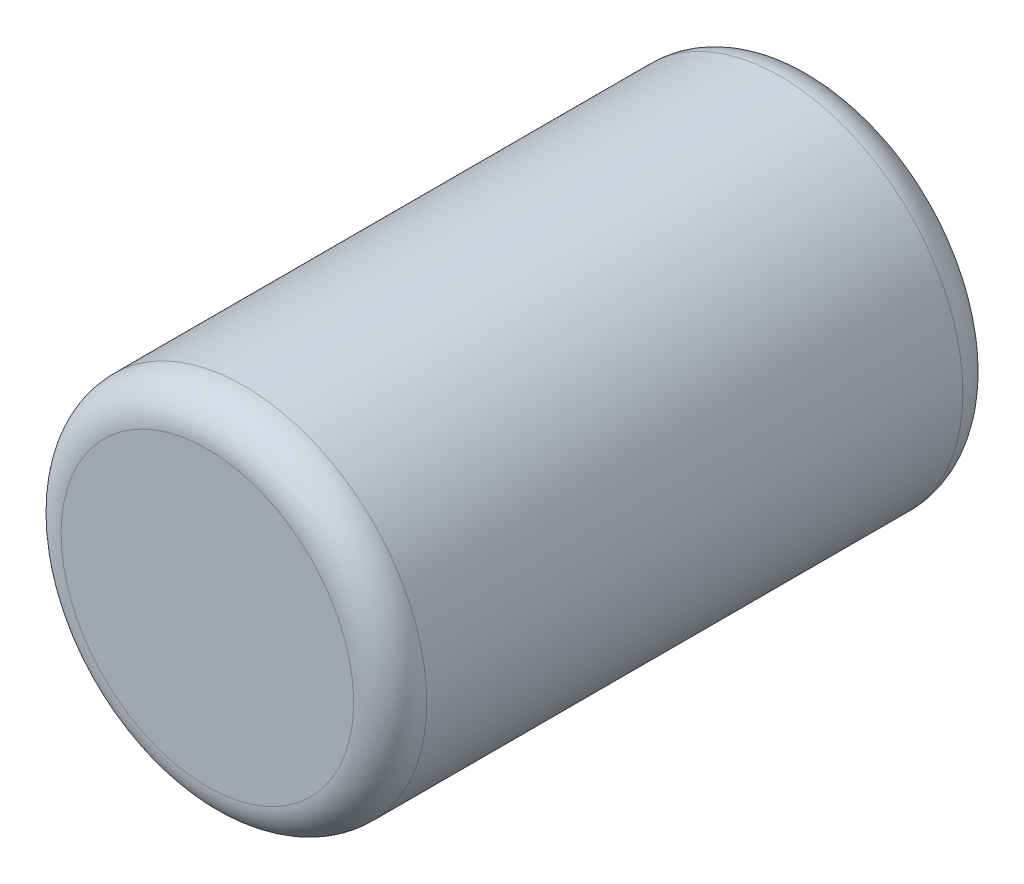
ISO-10303-21;
HEADER;
FILE_DESCRIPTION(('STEP AP214'),'2;1');
FILE_NAME('part.step','',(''),(''),'','','');
FILE_SCHEMA(('AUTOMOTIVE_DESIGN { 1 0 10303 214 1 1 1 1 }'));
ENDSEC;
DATA;
#1=APPLICATION_CONTEXT('core data for automotive mechanical design processes');
#2=APPLICATION_PROTOCOL_DEFINITION('international standard','automotive_design',2000,#1);
#3=PRODUCT_CONTEXT('',#1,'mechanical');
#4=PRODUCT('Part','Part','',(#3));
#5=PRODUCT_RELATED_PRODUCT_CATEGORY('part','',(#4));
#6=PRODUCT_DEFINITION_FORMATION('','',#4);
#7=PRODUCT_DEFINITION_CONTEXT('part definition',#1,'design');
#8=PRODUCT_DEFINITION('design','',#6,#7);
#9=PRODUCT_DEFINITION_SHAPE('','',#8);
#10=(LENGTH_UNIT() NAMED_UNIT(*) SI_UNIT(.MILLI.,.METRE.));
#11=(NAMED_UNIT(*) PLANE_ANGLE_UNIT() SI_UNIT($,.RADIAN.));
#12=(NAMED_UNIT(*) SI_UNIT($,.STERADIAN.) SOLID_ANGLE_UNIT());
#13=UNCERTAINTY_MEASURE_WITH_UNIT(LENGTH_MEASURE(1.E-05),#10,'distance_accuracy_value','');
#14=(GEOMETRIC_REPRESENTATION_CONTEXT(3) GLOBAL_UNCERTAINTY_ASSIGNED_CONTEXT((#13)) GLOBAL_UNIT_ASSIGNED_CONTEXT((#10,
#11,#12)) REPRESENTATION_CONTEXT('',''));
#15=CARTESIAN_POINT('',(0.,0.,0.));
#16=DIRECTION('',(0.,0.,1.));
#17=DIRECTION('',(1.,0.,0.));
#18=AXIS2_PLACEMENT_3D('',#15,#16,#17);
#19=CARTESIAN_POINT('',(0.,0.,0.));
#20=DIRECTION('',(0.,0.,1.));
#21=DIRECTION('',(1.,0.,0.));
#22=AXIS2_PLACEMENT_3D('',#19,#20,#21);
#23=PLANE('',#22);
#24=CARTESIAN_POINT('',(0.,0.,0.));
#25=DIRECTION('',(0.,0.,-1.));
#26=DIRECTION('',(-1.,0.,0.));
#27=AXIS2_PLACEMENT_3D('',#24,#25,#26);
#28=CIRCLE('',#27,1.2);
#29=CARTESIAN_POINT('',(-1.2,0.,0.));
#30=VERTEX_POINT('',#29);
#31=EDGE_CURVE('E10',#30,#30,#28,.T.);
#32=ORIENTED_EDGE('',*,*,#31,.T.);
#33=EDGE_LOOP('',(#32));
#34=FACE_BOUND('',#33,.T.);
#35=ADVANCED_FACE('F32',(#34),#23,.F.);
#36=CARTESIAN_POINT('',(0.,0.,0.3));
#37=DIRECTION('',(0.,0.,-1.));
#38=DIRECTION('',(-1.,0.,0.));
#39=AXIS2_PLACEMENT_3D('',#36,#37,#38);
#40=TOROIDAL_SURFACE('',#39,1.2,0.3);
#41=ORIENTED_EDGE('',*,*,#31,.F.);
#42=EDGE_LOOP('',(#41));
#43=FACE_BOUND('',#42,.T.);
#44=CARTESIAN_POINT('',(0.,0.,0.3));
#45=DIRECTION('',(0.,0.,-1.));
#46=DIRECTION('',(-1.,0.,0.));
#47=AXIS2_PLACEMENT_3D('',#44,#45,#46);
#48=CIRCLE('',#47,1.5);
#49=CARTESIAN_POINT('',(-1.5,0.,0.3));
#50=VERTEX_POINT('',#49);
#51=EDGE_CURVE('E38',#50,#50,#48,.T.);
#52=ORIENTED_EDGE('',*,*,#51,.T.);
#53=EDGE_LOOP('',(#52));
#54=FACE_BOUND('',#53,.T.);
#55=ADVANCED_FACE('F64',(#43,#54),#40,.T.);
#56=CARTESIAN_POINT('',(0.,0.,0.));
#57=DIRECTION('',(0.,0.,-1.));
#58=DIRECTION('',(-1.,0.,0.));
#59=AXIS2_PLACEMENT_3D('',#56,#57,#58);
#60=CYLINDRICAL_SURFACE('',#59,1.5);
#61=ORIENTED_EDGE('',*,*,#51,.F.);
#62=EDGE_LOOP('',(#61));
#63=FACE_BOUND('',#62,.T.);
#64=CARTESIAN_POINT('',(0.,0.,4.7));
#65=DIRECTION('',(0.,0.,-1.));
#66=DIRECTION('',(-1.,0.,0.));
#67=AXIS2_PLACEMENT_3D('',#64,#65,#66);
#68=CIRCLE('',#67,1.5);
#69=CARTESIAN_POINT('',(-1.5,0.,4.7));
#70=VERTEX_POINT('',#69);
#71=EDGE_CURVE('E42',#70,#70,#68,.T.);
#72=ORIENTED_EDGE('',*,*,#71,.T.);
#73=EDGE_LOOP('',(#72));
#74=FACE_BOUND('',#73,.T.);
#75=ADVANCED_FACE('F60',(#63,#74),#60,.T.);
#76=CARTESIAN_POINT('',(0.,0.,4.7));
#77=DIRECTION('',(0.,0.,-1.));
#78=DIRECTION('',(-1.,0.,0.));
#79=AXIS2_PLACEMENT_3D('',#76,#77,#78);
#80=TOROIDAL_SURFACE('',#79,1.2,0.3);
#81=ORIENTED_EDGE('',*,*,#71,.F.);
#82=EDGE_LOOP('',(#81));
#83=FACE_BOUND('',#82,.T.);
#84=CARTESIAN_POINT('',(0.,0.,5.));
#85=DIRECTION('',(0.,0.,-1.));
#86=DIRECTION('',(-1.,0.,0.));
#87=AXIS2_PLACEMENT_3D('',#84,#85,#86);
#88=CIRCLE('',#87,1.2);
#89=CARTESIAN_POINT('',(-1.2,0.,5.));
#90=VERTEX_POINT('',#89);
#91=EDGE_CURVE('E46',#90,#90,#88,.T.);
#92=ORIENTED_EDGE('',*,*,#91,.T.);
#93=EDGE_LOOP('',(#92));
#94=FACE_BOUND('',#93,.T.);
#95=ADVANCED_FACE('F52',(#83,#94),#80,.T.);
#96=CARTESIAN_POINT('',(0.,-1.2,5.));
#97=DIRECTION('',(0.,0.,-1.));
#98=DIRECTION('',(-1.,0.,0.));
#99=AXIS2_PLACEMENT_3D('',#96,#97,#98);
#100=PLANE('',#99);
#101=ORIENTED_EDGE('',*,*,#91,.F.);
#102=EDGE_LOOP('',(#101));
#103=FACE_BOUND('',#102,.T.);
#104=ADVANCED_FACE('F54',(#103),#100,.F.);
#105=CLOSED_SHELL('',(#35,#55,#75,#95,#104));
#106=MANIFOLD_SOLID_BREP('B2',#105);
#107=ADVANCED_BREP_SHAPE_REPRESENTATION('',(#18,#106),#14);
#108=SHAPE_DEFINITION_REPRESENTATION(#9,#107);
ENDSEC;
END-ISO-10303-21;
